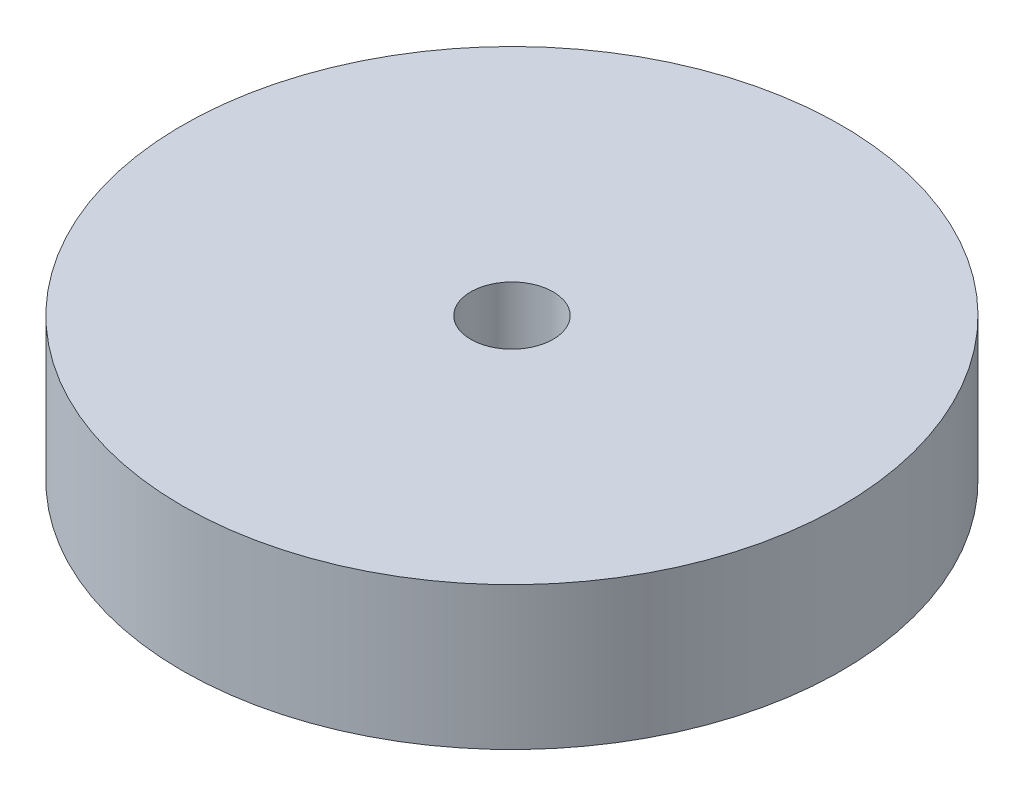
ISO-10303-21;
HEADER;
FILE_DESCRIPTION(('STEP AP214'),'2;1');
FILE_NAME('part.step','',(''),(''),'','','');
FILE_SCHEMA(('AUTOMOTIVE_DESIGN { 1 0 10303 214 1 1 1 1 }'));
ENDSEC;
DATA;
#1=APPLICATION_CONTEXT('core data for automotive mechanical design processes');
#2=APPLICATION_PROTOCOL_DEFINITION('international standard','automotive_design',2000,#1);
#3=PRODUCT_CONTEXT('',#1,'mechanical');
#4=PRODUCT('Part','Part','',(#3));
#5=PRODUCT_RELATED_PRODUCT_CATEGORY('part','',(#4));
#6=PRODUCT_DEFINITION_FORMATION('','',#4);
#7=PRODUCT_DEFINITION_CONTEXT('part definition',#1,'design');
#8=PRODUCT_DEFINITION('design','',#6,#7);
#9=PRODUCT_DEFINITION_SHAPE('','',#8);
#10=(LENGTH_UNIT() NAMED_UNIT(*) SI_UNIT(.MILLI.,.METRE.));
#11=(NAMED_UNIT(*) PLANE_ANGLE_UNIT() SI_UNIT($,.RADIAN.));
#12=(NAMED_UNIT(*) SI_UNIT($,.STERADIAN.) SOLID_ANGLE_UNIT());
#13=UNCERTAINTY_MEASURE_WITH_UNIT(LENGTH_MEASURE(1.E-05),#10,'distance_accuracy_value','');
#14=(GEOMETRIC_REPRESENTATION_CONTEXT(3) GLOBAL_UNCERTAINTY_ASSIGNED_CONTEXT((#13)) GLOBAL_UNIT_ASSIGNED_CONTEXT((#10,
#11,#12)) REPRESENTATION_CONTEXT('',''));
#15=CARTESIAN_POINT('',(0.,0.,0.));
#16=DIRECTION('',(0.,0.,1.));
#17=DIRECTION('',(1.,0.,0.));
#18=AXIS2_PLACEMENT_3D('',#15,#16,#17);
#19=CARTESIAN_POINT('',(0.,130.,0.));
#20=DIRECTION('',(0.,1.,0.));
#21=DIRECTION('',(0.,0.,1.));
#22=AXIS2_PLACEMENT_3D('',#19,#20,#21);
#23=PLANE('',#22);
#24=CARTESIAN_POINT('',(0.,130.,0.));
#25=DIRECTION('',(0.,1.,0.));
#26=DIRECTION('',(0.,0.,1.));
#27=AXIS2_PLACEMENT_3D('',#24,#25,#26);
#28=CIRCLE('',#27,300.);
#29=CARTESIAN_POINT('',(0.,130.,300.));
#30=VERTEX_POINT('',#29);
#31=EDGE_CURVE('E10',#30,#30,#28,.T.);
#32=ORIENTED_EDGE('',*,*,#31,.T.);
#33=EDGE_LOOP('',(#32));
#34=FACE_BOUND('',#33,.T.);
#35=CARTESIAN_POINT('',(0.,130.,0.));
#36=DIRECTION('',(0.,1.,0.));
#37=DIRECTION('',(0.,0.,1.));
#38=AXIS2_PLACEMENT_3D('',#35,#36,#37);
#39=CIRCLE('',#38,37.5);
#40=CARTESIAN_POINT('',(0.,130.,37.5));
#41=VERTEX_POINT('',#40);
#42=EDGE_CURVE('E42',#41,#41,#39,.T.);
#43=ORIENTED_EDGE('',*,*,#42,.F.);
#44=EDGE_LOOP('',(#43));
#45=FACE_BOUND('',#44,.T.);
#46=ADVANCED_FACE('F31',(#34,#45),#23,.T.);
#47=CARTESIAN_POINT('',(0.,0.,0.));
#48=DIRECTION('',(0.,1.,0.));
#49=DIRECTION('',(0.,0.,1.));
#50=AXIS2_PLACEMENT_3D('',#47,#48,#49);
#51=PLANE('',#50);
#52=CARTESIAN_POINT('',(0.,0.,0.));
#53=DIRECTION('',(0.,1.,0.));
#54=DIRECTION('',(0.,0.,1.));
#55=AXIS2_PLACEMENT_3D('',#52,#53,#54);
#56=CIRCLE('',#55,300.);
#57=CARTESIAN_POINT('',(0.,0.,300.));
#58=VERTEX_POINT('',#57);
#59=EDGE_CURVE('E35',#58,#58,#56,.T.);
#60=ORIENTED_EDGE('',*,*,#59,.F.);
#61=EDGE_LOOP('',(#60));
#62=FACE_BOUND('',#61,.T.);
#63=CARTESIAN_POINT('',(0.,0.,0.));
#64=DIRECTION('',(0.,1.,0.));
#65=DIRECTION('',(0.,0.,1.));
#66=AXIS2_PLACEMENT_3D('',#63,#64,#65);
#67=CIRCLE('',#66,37.5);
#68=CARTESIAN_POINT('',(0.,0.,37.5));
#69=VERTEX_POINT('',#68);
#70=EDGE_CURVE('E44',#69,#69,#67,.T.);
#71=ORIENTED_EDGE('',*,*,#70,.T.);
#72=EDGE_LOOP('',(#71));
#73=FACE_BOUND('',#72,.T.);
#74=ADVANCED_FACE('F54',(#62,#73),#51,.F.);
#75=CARTESIAN_POINT('',(0.,130.,0.));
#76=DIRECTION('',(0.,-1.,0.));
#77=DIRECTION('',(0.,0.,-1.));
#78=AXIS2_PLACEMENT_3D('',#75,#76,#77);
#79=CYLINDRICAL_SURFACE('',#78,300.);
#80=ORIENTED_EDGE('',*,*,#31,.F.);
#81=EDGE_LOOP('',(#80));
#82=FACE_BOUND('',#81,.T.);
#83=ORIENTED_EDGE('',*,*,#59,.T.);
#84=EDGE_LOOP('',(#83));
#85=FACE_BOUND('',#84,.T.);
#86=ADVANCED_FACE('F33',(#82,#85),#79,.T.);
#87=CARTESIAN_POINT('',(0.,130.,0.));
#88=DIRECTION('',(0.,-1.,0.));
#89=DIRECTION('',(0.,0.,-1.));
#90=AXIS2_PLACEMENT_3D('',#87,#88,#89);
#91=CYLINDRICAL_SURFACE('',#90,37.5);
#92=ORIENTED_EDGE('',*,*,#42,.T.);
#93=EDGE_LOOP('',(#92));
#94=FACE_BOUND('',#93,.T.);
#95=ORIENTED_EDGE('',*,*,#70,.F.);
#96=EDGE_LOOP('',(#95));
#97=FACE_BOUND('',#96,.T.);
#98=ADVANCED_FACE('F50',(#94,#97),#91,.F.);
#99=CLOSED_SHELL('',(#46,#74,#86,#98));
#100=MANIFOLD_SOLID_BREP('B2',#99);
#101=ADVANCED_BREP_SHAPE_REPRESENTATION('',(#18,#100),#14);
#102=SHAPE_DEFINITION_REPRESENTATION(#9,#101);
ENDSEC;
END-ISO-10303-21;
